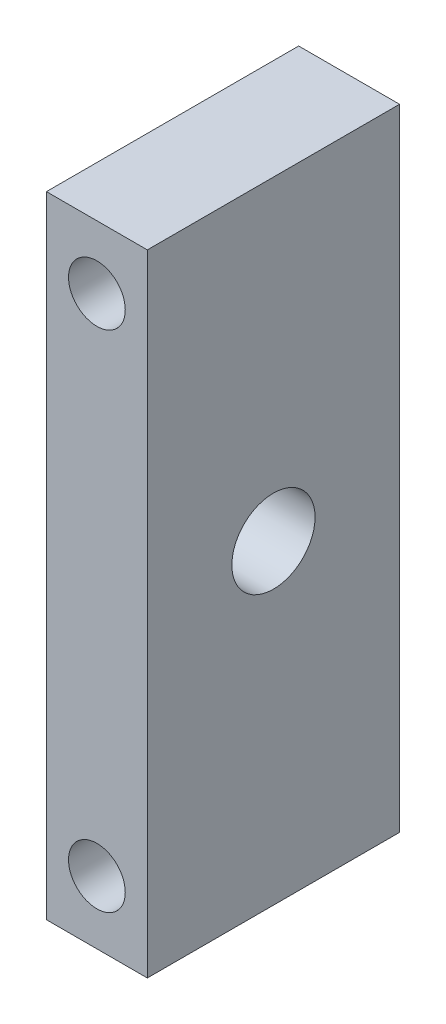
ISO-10303-21;
HEADER;
FILE_DESCRIPTION(('STEP AP214'),'2;1');
FILE_NAME('part.step','',(''),(''),'','','');
FILE_SCHEMA(('AUTOMOTIVE_DESIGN { 1 0 10303 214 1 1 1 1 }'));
ENDSEC;
DATA;
#1=APPLICATION_CONTEXT('core data for automotive mechanical design processes');
#2=APPLICATION_PROTOCOL_DEFINITION('international standard','automotive_design',2000,#1);
#3=PRODUCT_CONTEXT('',#1,'mechanical');
#4=PRODUCT('Part','Part','',(#3));
#5=PRODUCT_RELATED_PRODUCT_CATEGORY('part','',(#4));
#6=PRODUCT_DEFINITION_FORMATION('','',#4);
#7=PRODUCT_DEFINITION_CONTEXT('part definition',#1,'design');
#8=PRODUCT_DEFINITION('design','',#6,#7);
#9=PRODUCT_DEFINITION_SHAPE('','',#8);
#10=(LENGTH_UNIT() NAMED_UNIT(*) SI_UNIT(.MILLI.,.METRE.));
#11=(NAMED_UNIT(*) PLANE_ANGLE_UNIT() SI_UNIT($,.RADIAN.));
#12=(NAMED_UNIT(*) SI_UNIT($,.STERADIAN.) SOLID_ANGLE_UNIT());
#13=UNCERTAINTY_MEASURE_WITH_UNIT(LENGTH_MEASURE(1.E-05),#10,'distance_accuracy_value','');
#14=(GEOMETRIC_REPRESENTATION_CONTEXT(3) GLOBAL_UNCERTAINTY_ASSIGNED_CONTEXT((#13)) GLOBAL_UNIT_ASSIGNED_CONTEXT((#10,
#11,#12)) REPRESENTATION_CONTEXT('',''));
#15=CARTESIAN_POINT('',(0.,0.,0.));
#16=DIRECTION('',(0.,0.,1.));
#17=DIRECTION('',(1.,0.,0.));
#18=AXIS2_PLACEMENT_3D('',#15,#16,#17);
#19=CARTESIAN_POINT('',(4.0023,5.,0.001600000000053));
#20=DIRECTION('',(0.,0.,1.));
#21=DIRECTION('',(1.,0.,0.));
#22=AXIS2_PLACEMENT_3D('',#19,#20,#21);
#23=CYLINDRICAL_SURFACE('',#22,2.25);
#24=CARTESIAN_POINT('',(4.0023,5.,0.001600000000053));
#25=DIRECTION('',(0.,0.,1.));
#26=DIRECTION('',(1.,0.,0.));
#27=AXIS2_PLACEMENT_3D('',#24,#25,#26);
#28=CIRCLE('',#27,2.25);
#29=CARTESIAN_POINT('',(6.2523,5.,0.001600000000053));
#30=VERTEX_POINT('',#29);
#31=EDGE_CURVE('E19',#30,#30,#28,.F.);
#32=ORIENTED_EDGE('',*,*,#31,.T.);
#33=EDGE_LOOP('',(#32));
#34=FACE_BOUND('',#33,.T.);
#35=CARTESIAN_POINT('',(4.0023,5.,20.0016));
#36=DIRECTION('',(0.,0.,1.));
#37=DIRECTION('',(1.,0.,0.));
#38=AXIS2_PLACEMENT_3D('',#35,#36,#37);
#39=CIRCLE('',#38,2.25);
#40=CARTESIAN_POINT('',(6.2523,5.,20.0016));
#41=VERTEX_POINT('',#40);
#42=EDGE_CURVE('E86',#41,#41,#39,.F.);
#43=ORIENTED_EDGE('',*,*,#42,.F.);
#44=EDGE_LOOP('',(#43));
#45=FACE_BOUND('',#44,.T.);
#46=ADVANCED_FACE('F16',(#34,#45),#23,.F.);
#47=CARTESIAN_POINT('',(4.0023,45.,0.001600000000053));
#48=DIRECTION('',(0.,0.,1.));
#49=DIRECTION('',(1.,0.,0.));
#50=AXIS2_PLACEMENT_3D('',#47,#48,#49);
#51=CYLINDRICAL_SURFACE('',#50,2.25);
#52=CARTESIAN_POINT('',(4.0023,45.,0.001600000000053));
#53=DIRECTION('',(0.,0.,1.));
#54=DIRECTION('',(1.,0.,0.));
#55=AXIS2_PLACEMENT_3D('',#52,#53,#54);
#56=CIRCLE('',#55,2.25);
#57=CARTESIAN_POINT('',(6.2523,45.,0.001600000000053));
#58=VERTEX_POINT('',#57);
#59=EDGE_CURVE('E88',#58,#58,#56,.F.);
#60=ORIENTED_EDGE('',*,*,#59,.T.);
#61=EDGE_LOOP('',(#60));
#62=FACE_BOUND('',#61,.T.);
#63=CARTESIAN_POINT('',(4.0023,45.,20.0016));
#64=DIRECTION('',(0.,0.,1.));
#65=DIRECTION('',(1.,0.,0.));
#66=AXIS2_PLACEMENT_3D('',#63,#64,#65);
#67=CIRCLE('',#66,2.25);
#68=CARTESIAN_POINT('',(6.2523,45.,20.0016));
#69=VERTEX_POINT('',#68);
#70=EDGE_CURVE('E83',#69,#69,#67,.F.);
#71=ORIENTED_EDGE('',*,*,#70,.F.);
#72=EDGE_LOOP('',(#71));
#73=FACE_BOUND('',#72,.T.);
#74=ADVANCED_FACE('F145',(#62,#73),#51,.F.);
#75=CARTESIAN_POINT('',(8.0023,0.,0.001600000000053));
#76=DIRECTION('',(1.,0.,0.));
#77=DIRECTION('',(0.,0.,-1.));
#78=AXIS2_PLACEMENT_3D('',#75,#76,#77);
#79=PLANE('',#78);
#80=CARTESIAN_POINT('',(8.0023,25.,10.0016));
#81=DIRECTION('',(1.,0.,0.));
#82=DIRECTION('',(0.,0.,-1.));
#83=AXIS2_PLACEMENT_3D('',#80,#81,#82);
#84=CIRCLE('',#83,3.3);
#85=CARTESIAN_POINT('',(8.0023,25.,6.7016));
#86=VERTEX_POINT('',#85);
#87=EDGE_CURVE('E80',#86,#86,#84,.F.);
#88=ORIENTED_EDGE('',*,*,#87,.T.);
#89=EDGE_LOOP('',(#88));
#90=FACE_BOUND('',#89,.T.);
#91=DIRECTION('',(0.,0.,1.));
#92=VECTOR('',#91,1.);
#93=CARTESIAN_POINT('',(8.0023,50.,0.001600000000053));
#94=LINE('',#93,#92);
#95=CARTESIAN_POINT('',(8.0023,50.,20.0016));
#96=VERTEX_POINT('',#95);
#97=CARTESIAN_POINT('',(8.0023,50.,0.001600000000053));
#98=VERTEX_POINT('',#97);
#99=EDGE_CURVE('E92',#96,#98,#94,.F.);
#100=ORIENTED_EDGE('',*,*,#99,.F.);
#101=DIRECTION('',(0.,1.,0.));
#102=VECTOR('',#101,1.);
#103=CARTESIAN_POINT('',(8.0023,0.,20.0016));
#104=LINE('',#103,#102);
#105=CARTESIAN_POINT('',(8.0023,0.,20.0016));
#106=VERTEX_POINT('',#105);
#107=EDGE_CURVE('E60',#106,#96,#104,.T.);
#108=ORIENTED_EDGE('',*,*,#107,.F.);
#109=DIRECTION('',(0.,0.,1.));
#110=VECTOR('',#109,1.);
#111=CARTESIAN_POINT('',(8.0023,0.,0.001600000000053));
#112=LINE('',#111,#110);
#113=CARTESIAN_POINT('',(8.0023,0.,0.001600000000053));
#114=VERTEX_POINT('',#113);
#115=EDGE_CURVE('E58',#106,#114,#112,.F.);
#116=ORIENTED_EDGE('',*,*,#115,.T.);
#117=DIRECTION('',(0.,1.,0.));
#118=VECTOR('',#117,1.);
#119=CARTESIAN_POINT('',(8.0023,0.,0.001600000000053));
#120=LINE('',#119,#118);
#121=EDGE_CURVE('E55',#114,#98,#120,.T.);
#122=ORIENTED_EDGE('',*,*,#121,.T.);
#123=EDGE_LOOP('',(#100,#108,#116,#122));
#124=FACE_BOUND('',#123,.T.);
#125=ADVANCED_FACE('F59',(#90,#124),#79,.T.);
#126=CARTESIAN_POINT('',(0.002300000000105,0.,0.001600000000053));
#127=DIRECTION('',(0.,1.,0.));
#128=DIRECTION('',(0.,0.,1.));
#129=AXIS2_PLACEMENT_3D('',#126,#127,#128);
#130=PLANE('',#129);
#131=DIRECTION('',(1.,0.,0.));
#132=VECTOR('',#131,1.);
#133=CARTESIAN_POINT('',(0.002300000000105,0.,20.0016));
#134=LINE('',#133,#132);
#135=CARTESIAN_POINT('',(0.0023000000000195,0.,20.0016));
#136=VERTEX_POINT('',#135);
#137=EDGE_CURVE('E131',#136,#106,#134,.T.);
#138=ORIENTED_EDGE('',*,*,#137,.F.);
#139=DIRECTION('',(0.,0.,-1.));
#140=VECTOR('',#139,1.);
#141=CARTESIAN_POINT('',(0.002300000000105,0.,0.001600000000053));
#142=LINE('',#141,#140);
#143=CARTESIAN_POINT('',(0.0023000000000195,0.,0.001600000000053));
#144=VERTEX_POINT('',#143);
#145=EDGE_CURVE('E76',#136,#144,#142,.T.);
#146=ORIENTED_EDGE('',*,*,#145,.T.);
#147=DIRECTION('',(1.,0.,0.));
#148=VECTOR('',#147,1.);
#149=CARTESIAN_POINT('',(0.002300000000105,0.,0.001600000000053));
#150=LINE('',#149,#148);
#151=EDGE_CURVE('E65',#144,#114,#150,.T.);
#152=ORIENTED_EDGE('',*,*,#151,.T.);
#153=ORIENTED_EDGE('',*,*,#115,.F.);
#154=EDGE_LOOP('',(#138,#146,#152,#153));
#155=FACE_BOUND('',#154,.T.);
#156=ADVANCED_FACE('F75',(#155),#130,.F.);
#157=CARTESIAN_POINT('',(0.002300000000105,0.,0.001600000000053));
#158=DIRECTION('',(0.,0.,1.));
#159=DIRECTION('',(1.,0.,0.));
#160=AXIS2_PLACEMENT_3D('',#157,#158,#159);
#161=PLANE('',#160);
#162=ORIENTED_EDGE('',*,*,#59,.F.);
#163=EDGE_LOOP('',(#162));
#164=FACE_BOUND('',#163,.T.);
#165=ORIENTED_EDGE('',*,*,#31,.F.);
#166=EDGE_LOOP('',(#165));
#167=FACE_BOUND('',#166,.T.);
#168=ORIENTED_EDGE('',*,*,#121,.F.);
#169=ORIENTED_EDGE('',*,*,#151,.F.);
#170=DIRECTION('',(0.,1.,0.));
#171=VECTOR('',#170,1.);
#172=CARTESIAN_POINT('',(0.002300000000105,0.,0.001600000000053));
#173=LINE('',#172,#171);
#174=CARTESIAN_POINT('',(0.0023000000000195,50.,0.001600000000053));
#175=VERTEX_POINT('',#174);
#176=EDGE_CURVE('E141',#144,#175,#173,.T.);
#177=ORIENTED_EDGE('',*,*,#176,.T.);
#178=DIRECTION('',(1.,0.,0.));
#179=VECTOR('',#178,1.);
#180=CARTESIAN_POINT('',(0.002300000000105,50.,0.001600000000053));
#181=LINE('',#180,#179);
#182=EDGE_CURVE('E72',#98,#175,#181,.F.);
#183=ORIENTED_EDGE('',*,*,#182,.F.);
#184=EDGE_LOOP('',(#168,#169,#177,#183));
#185=FACE_BOUND('',#184,.T.);
#186=ADVANCED_FACE('F69',(#164,#167,#185),#161,.F.);
#187=CARTESIAN_POINT('',(0.002300000000105,50.,0.001600000000053));
#188=DIRECTION('',(0.,1.,0.));
#189=DIRECTION('',(0.,0.,1.));
#190=AXIS2_PLACEMENT_3D('',#187,#188,#189);
#191=PLANE('',#190);
#192=DIRECTION('',(1.,0.,0.));
#193=VECTOR('',#192,1.);
#194=CARTESIAN_POINT('',(0.002300000000105,50.,20.0016));
#195=LINE('',#194,#193);
#196=CARTESIAN_POINT('',(0.0023000000000195,50.,20.0016));
#197=VERTEX_POINT('',#196);
#198=EDGE_CURVE('E34',#96,#197,#195,.F.);
#199=ORIENTED_EDGE('',*,*,#198,.F.);
#200=ORIENTED_EDGE('',*,*,#99,.T.);
#201=ORIENTED_EDGE('',*,*,#182,.T.);
#202=DIRECTION('',(0.,0.,-1.));
#203=VECTOR('',#202,1.);
#204=CARTESIAN_POINT('',(0.002300000000105,50.,0.001600000000053));
#205=LINE('',#204,#203);
#206=EDGE_CURVE('E136',#175,#197,#205,.F.);
#207=ORIENTED_EDGE('',*,*,#206,.T.);
#208=EDGE_LOOP('',(#199,#200,#201,#207));
#209=FACE_BOUND('',#208,.T.);
#210=ADVANCED_FACE('F99',(#209),#191,.T.);
#211=CARTESIAN_POINT('',(0.002300000000105,0.,20.0016));
#212=DIRECTION('',(0.,0.,1.));
#213=DIRECTION('',(1.,0.,0.));
#214=AXIS2_PLACEMENT_3D('',#211,#212,#213);
#215=PLANE('',#214);
#216=ORIENTED_EDGE('',*,*,#70,.T.);
#217=EDGE_LOOP('',(#216));
#218=FACE_BOUND('',#217,.T.);
#219=ORIENTED_EDGE('',*,*,#42,.T.);
#220=EDGE_LOOP('',(#219));
#221=FACE_BOUND('',#220,.T.);
#222=ORIENTED_EDGE('',*,*,#107,.T.);
#223=ORIENTED_EDGE('',*,*,#198,.T.);
#224=DIRECTION('',(0.,1.,0.));
#225=VECTOR('',#224,1.);
#226=CARTESIAN_POINT('',(0.002300000000105,0.,20.0016));
#227=LINE('',#226,#225);
#228=EDGE_CURVE('E25',#197,#136,#227,.F.);
#229=ORIENTED_EDGE('',*,*,#228,.T.);
#230=ORIENTED_EDGE('',*,*,#137,.T.);
#231=EDGE_LOOP('',(#222,#223,#229,#230));
#232=FACE_BOUND('',#231,.T.);
#233=ADVANCED_FACE('F107',(#218,#221,#232),#215,.T.);
#234=CARTESIAN_POINT('',(0.002300000000105,25.,10.0016));
#235=DIRECTION('',(1.,0.,0.));
#236=DIRECTION('',(0.,0.,-1.));
#237=AXIS2_PLACEMENT_3D('',#234,#235,#236);
#238=CYLINDRICAL_SURFACE('',#237,3.3);
#239=CARTESIAN_POINT('',(0.002299999999991,25.,10.0016));
#240=DIRECTION('',(1.,0.,0.));
#241=DIRECTION('',(0.,0.,-1.));
#242=AXIS2_PLACEMENT_3D('',#239,#240,#241);
#243=CIRCLE('',#242,3.3);
#244=CARTESIAN_POINT('',(0.002299999999991,25.,6.7016));
#245=VERTEX_POINT('',#244);
#246=EDGE_CURVE('E11',#245,#245,#243,.F.);
#247=ORIENTED_EDGE('',*,*,#246,.T.);
#248=EDGE_LOOP('',(#247));
#249=FACE_BOUND('',#248,.T.);
#250=ORIENTED_EDGE('',*,*,#87,.F.);
#251=EDGE_LOOP('',(#250));
#252=FACE_BOUND('',#251,.T.);
#253=ADVANCED_FACE('F113',(#249,#252),#238,.F.);
#254=CARTESIAN_POINT('',(0.002300000000105,0.,0.001600000000053));
#255=DIRECTION('',(1.,0.,0.));
#256=DIRECTION('',(0.,0.,-1.));
#257=AXIS2_PLACEMENT_3D('',#254,#255,#256);
#258=PLANE('',#257);
#259=ORIENTED_EDGE('',*,*,#246,.F.);
#260=EDGE_LOOP('',(#259));
#261=FACE_BOUND('',#260,.T.);
#262=ORIENTED_EDGE('',*,*,#206,.F.);
#263=ORIENTED_EDGE('',*,*,#176,.F.);
#264=ORIENTED_EDGE('',*,*,#145,.F.);
#265=ORIENTED_EDGE('',*,*,#228,.F.);
#266=EDGE_LOOP('',(#262,#263,#264,#265));
#267=FACE_BOUND('',#266,.T.);
#268=ADVANCED_FACE('F111',(#261,#267),#258,.F.);
#269=CLOSED_SHELL('',(#46,#74,#125,#156,#186,#210,#233,#253,#268));
#270=MANIFOLD_SOLID_BREP('B1',#269);
#271=ADVANCED_BREP_SHAPE_REPRESENTATION('',(#18,#270),#14);
#272=SHAPE_DEFINITION_REPRESENTATION(#9,#271);
ENDSEC;
END-ISO-10303-21;
